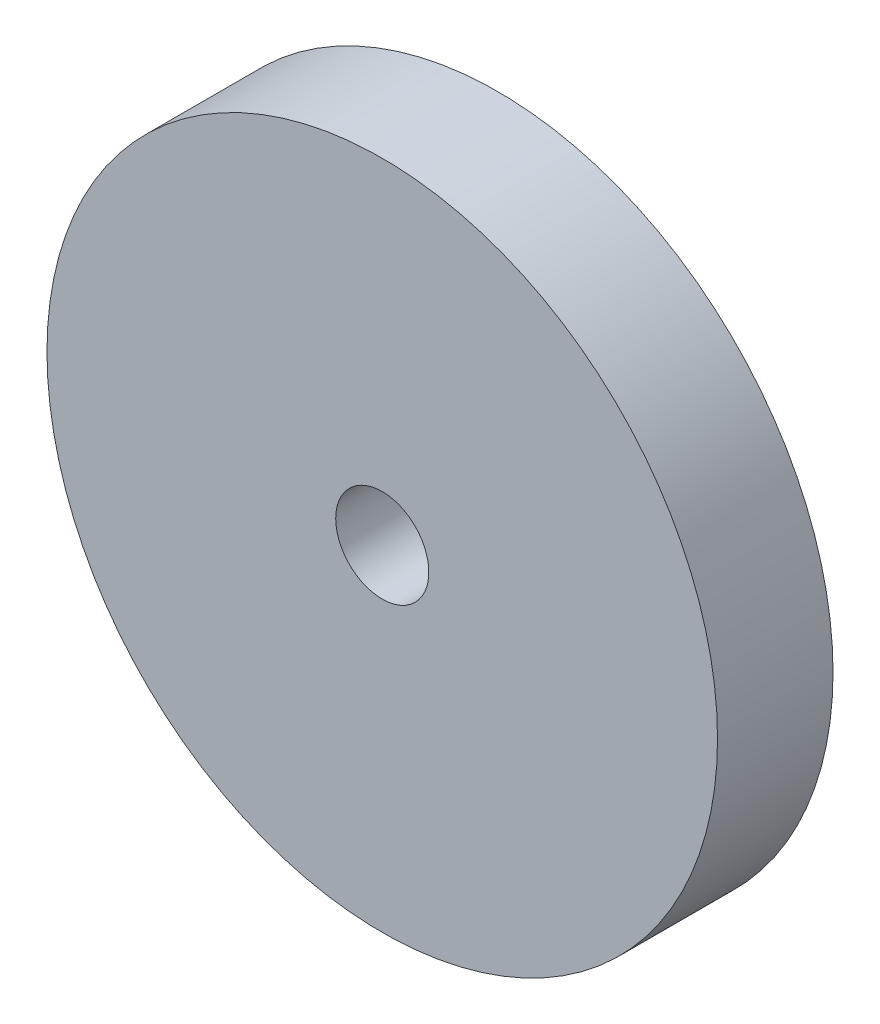
ISO-10303-21;
HEADER;
FILE_DESCRIPTION(('STEP AP214'),'2;1');
FILE_NAME('part.step','',(''),(''),'','','');
FILE_SCHEMA(('AUTOMOTIVE_DESIGN { 1 0 10303 214 1 1 1 1 }'));
ENDSEC;
DATA;
#1=APPLICATION_CONTEXT('core data for automotive mechanical design processes');
#2=APPLICATION_PROTOCOL_DEFINITION('international standard','automotive_design',2000,#1);
#3=PRODUCT_CONTEXT('',#1,'mechanical');
#4=PRODUCT('Part','Part','',(#3));
#5=PRODUCT_RELATED_PRODUCT_CATEGORY('part','',(#4));
#6=PRODUCT_DEFINITION_FORMATION('','',#4);
#7=PRODUCT_DEFINITION_CONTEXT('part definition',#1,'design');
#8=PRODUCT_DEFINITION('design','',#6,#7);
#9=PRODUCT_DEFINITION_SHAPE('','',#8);
#10=(LENGTH_UNIT() NAMED_UNIT(*) SI_UNIT(.MILLI.,.METRE.));
#11=(NAMED_UNIT(*) PLANE_ANGLE_UNIT() SI_UNIT($,.RADIAN.));
#12=(NAMED_UNIT(*) SI_UNIT($,.STERADIAN.) SOLID_ANGLE_UNIT());
#13=UNCERTAINTY_MEASURE_WITH_UNIT(LENGTH_MEASURE(1.E-05),#10,'distance_accuracy_value','');
#14=(GEOMETRIC_REPRESENTATION_CONTEXT(3) GLOBAL_UNCERTAINTY_ASSIGNED_CONTEXT((#13)) GLOBAL_UNIT_ASSIGNED_CONTEXT((#10,
#11,#12)) REPRESENTATION_CONTEXT('',''));
#15=CARTESIAN_POINT('',(0.,0.,0.));
#16=DIRECTION('',(0.,0.,1.));
#17=DIRECTION('',(1.,0.,0.));
#18=AXIS2_PLACEMENT_3D('',#15,#16,#17);
#19=CARTESIAN_POINT('',(0.,0.,6.2));
#20=DIRECTION('',(0.,0.,1.));
#21=DIRECTION('',(1.,0.,0.));
#22=AXIS2_PLACEMENT_3D('',#19,#20,#21);
#23=PLANE('',#22);
#24=CARTESIAN_POINT('',(0.,0.,6.2));
#25=DIRECTION('',(0.,0.,1.));
#26=DIRECTION('',(1.,0.,0.));
#27=AXIS2_PLACEMENT_3D('',#24,#25,#26);
#28=CIRCLE('',#27,18.);
#29=CARTESIAN_POINT('',(-18.,0.,6.2));
#30=VERTEX_POINT('',#29);
#31=EDGE_CURVE('E10',#30,#30,#28,.T.);
#32=ORIENTED_EDGE('',*,*,#31,.T.);
#33=EDGE_LOOP('',(#32));
#34=FACE_BOUND('',#33,.T.);
#35=CARTESIAN_POINT('',(0.,0.,6.2));
#36=DIRECTION('',(0.,0.,1.));
#37=DIRECTION('',(1.,0.,0.));
#38=AXIS2_PLACEMENT_3D('',#35,#36,#37);
#39=CIRCLE('',#38,2.5);
#40=CARTESIAN_POINT('',(-2.5,0.,6.2));
#41=VERTEX_POINT('',#40);
#42=EDGE_CURVE('E44',#41,#41,#39,.T.);
#43=ORIENTED_EDGE('',*,*,#42,.F.);
#44=EDGE_LOOP('',(#43));
#45=FACE_BOUND('',#44,.T.);
#46=ADVANCED_FACE('F33',(#34,#45),#23,.T.);
#47=CARTESIAN_POINT('',(0.,0.,0.));
#48=DIRECTION('',(0.,0.,1.));
#49=DIRECTION('',(1.,0.,0.));
#50=AXIS2_PLACEMENT_3D('',#47,#48,#49);
#51=PLANE('',#50);
#52=CARTESIAN_POINT('',(0.,0.,0.));
#53=DIRECTION('',(0.,0.,1.));
#54=DIRECTION('',(1.,0.,0.));
#55=AXIS2_PLACEMENT_3D('',#52,#53,#54);
#56=CIRCLE('',#55,18.);
#57=CARTESIAN_POINT('',(-18.,0.,0.));
#58=VERTEX_POINT('',#57);
#59=EDGE_CURVE('E37',#58,#58,#56,.T.);
#60=ORIENTED_EDGE('',*,*,#59,.F.);
#61=EDGE_LOOP('',(#60));
#62=FACE_BOUND('',#61,.T.);
#63=CARTESIAN_POINT('',(0.,0.,0.));
#64=DIRECTION('',(0.,0.,1.));
#65=DIRECTION('',(1.,0.,0.));
#66=AXIS2_PLACEMENT_3D('',#63,#64,#65);
#67=CIRCLE('',#66,2.5);
#68=CARTESIAN_POINT('',(-2.5,0.,0.));
#69=VERTEX_POINT('',#68);
#70=EDGE_CURVE('E46',#69,#69,#67,.T.);
#71=ORIENTED_EDGE('',*,*,#70,.T.);
#72=EDGE_LOOP('',(#71));
#73=FACE_BOUND('',#72,.T.);
#74=ADVANCED_FACE('F56',(#62,#73),#51,.F.);
#75=CARTESIAN_POINT('',(0.,0.,6.2));
#76=DIRECTION('',(0.,0.,-1.));
#77=DIRECTION('',(-1.,0.,0.));
#78=AXIS2_PLACEMENT_3D('',#75,#76,#77);
#79=CYLINDRICAL_SURFACE('',#78,18.);
#80=CARTESIAN_POINT('',(-18.,0.,6.2));
#81=CARTESIAN_POINT('',(-18.,0.,6.13541666666667));
#82=CARTESIAN_POINT('',(-18.,0.,6.07083333333333));
#83=CARTESIAN_POINT('',(-18.,0.,5.94166666666667));
#84=CARTESIAN_POINT('',(-18.,0.,5.87708333333333));
#85=CARTESIAN_POINT('',(-18.,0.,5.74791666666667));
#86=CARTESIAN_POINT('',(-18.,0.,5.68333333333333));
#87=CARTESIAN_POINT('',(-18.,0.,5.55416666666667));
#88=CARTESIAN_POINT('',(-18.,0.,5.48958333333333));
#89=CARTESIAN_POINT('',(-18.,0.,5.36041666666667));
#90=CARTESIAN_POINT('',(-18.,0.,5.29583333333333));
#91=CARTESIAN_POINT('',(-18.,0.,5.16666666666667));
#92=CARTESIAN_POINT('',(-18.,0.,5.10208333333333));
#93=CARTESIAN_POINT('',(-18.,0.,4.97291666666667));
#94=CARTESIAN_POINT('',(-18.,0.,4.90833333333333));
#95=CARTESIAN_POINT('',(-18.,0.,4.77916666666667));
#96=CARTESIAN_POINT('',(-18.,0.,4.71458333333333));
#97=CARTESIAN_POINT('',(-18.,0.,4.58541666666667));
#98=CARTESIAN_POINT('',(-18.,0.,4.52083333333333));
#99=CARTESIAN_POINT('',(-18.,0.,4.39166666666667));
#100=CARTESIAN_POINT('',(-18.,0.,4.32708333333333));
#101=CARTESIAN_POINT('',(-18.,0.,4.19791666666667));
#102=CARTESIAN_POINT('',(-18.,0.,4.13333333333333));
#103=CARTESIAN_POINT('',(-18.,0.,4.00416666666667));
#104=CARTESIAN_POINT('',(-18.,0.,3.93958333333333));
#105=CARTESIAN_POINT('',(-18.,0.,3.81041666666667));
#106=CARTESIAN_POINT('',(-18.,0.,3.74583333333333));
#107=CARTESIAN_POINT('',(-18.,0.,3.61666666666667));
#108=CARTESIAN_POINT('',(-18.,0.,3.55208333333333));
#109=CARTESIAN_POINT('',(-18.,0.,3.42291666666667));
#110=CARTESIAN_POINT('',(-18.,0.,3.35833333333333));
#111=CARTESIAN_POINT('',(-18.,0.,3.22916666666667));
#112=CARTESIAN_POINT('',(-18.,0.,3.16458333333333));
#113=CARTESIAN_POINT('',(-18.,0.,3.03541666666667));
#114=CARTESIAN_POINT('',(-18.,0.,2.97083333333333));
#115=CARTESIAN_POINT('',(-18.,0.,2.84166666666667));
#116=CARTESIAN_POINT('',(-18.,0.,2.77708333333333));
#117=CARTESIAN_POINT('',(-18.,0.,2.64791666666667));
#118=CARTESIAN_POINT('',(-18.,0.,2.58333333333333));
#119=CARTESIAN_POINT('',(-18.,0.,2.45416666666667));
#120=CARTESIAN_POINT('',(-18.,0.,2.38958333333333));
#121=CARTESIAN_POINT('',(-18.,0.,2.26041666666667));
#122=CARTESIAN_POINT('',(-18.,0.,2.19583333333333));
#123=CARTESIAN_POINT('',(-18.,0.,2.06666666666667));
#124=CARTESIAN_POINT('',(-18.,0.,2.00208333333333));
#125=CARTESIAN_POINT('',(-18.,0.,1.87291666666667));
#126=CARTESIAN_POINT('',(-18.,0.,1.80833333333333));
#127=CARTESIAN_POINT('',(-18.,0.,1.67916666666667));
#128=CARTESIAN_POINT('',(-18.,0.,1.61458333333333));
#129=CARTESIAN_POINT('',(-18.,0.,1.48541666666667));
#130=CARTESIAN_POINT('',(-18.,0.,1.42083333333333));
#131=CARTESIAN_POINT('',(-18.,0.,1.29166666666667));
#132=CARTESIAN_POINT('',(-18.,0.,1.22708333333333));
#133=CARTESIAN_POINT('',(-18.,0.,1.09791666666667));
#134=CARTESIAN_POINT('',(-18.,0.,1.03333333333333));
#135=CARTESIAN_POINT('',(-18.,0.,0.904166666666667));
#136=CARTESIAN_POINT('',(-18.,0.,0.839583333333333));
#137=CARTESIAN_POINT('',(-18.,0.,0.710416666666666));
#138=CARTESIAN_POINT('',(-18.,0.,0.645833333333333));
#139=CARTESIAN_POINT('',(-18.,0.,0.516666666666667));
#140=CARTESIAN_POINT('',(-18.,0.,0.452083333333333));
#141=CARTESIAN_POINT('',(-18.,0.,0.322916666666667));
#142=CARTESIAN_POINT('',(-18.,0.,0.258333333333334));
#143=CARTESIAN_POINT('',(-18.,0.,0.129166666666667));
#144=CARTESIAN_POINT('',(-18.,0.,0.0645833333333335));
#145=CARTESIAN_POINT('',(-18.,0.,0.));
#146=B_SPLINE_CURVE_WITH_KNOTS('',3,(#80,#81,#82,#83,#84,#85,#86,#87,#88,#89,#90,#91,#92,#93,
#94,#95,#96,#97,#98,#99,#100,#101,#102,#103,#104,#105,#106,#107,#108,#109,#110,#111,#112,#113,
#114,#115,#116,#117,#118,#119,#120,#121,#122,#123,#124,#125,#126,#127,#128,#129,#130,#131,#132,
#133,#134,#135,#136,#137,#138,#139,#140,#141,#142,#143,#144,#145),.UNSPECIFIED.,.F.,.F.,(4,2,2,
2,2,2,2,2,2,2,2,2,2,2,2,2,2,2,2,2,2,2,2,2,2,2,2,2,2,2,2,2,4),(0.,0.193749999999999,0.3875,
0.581249999999999,0.775,0.968749999999999,1.1625,1.35625,1.55,1.74375,1.9375,2.13125,2.325,
2.51875,2.7125,2.90625,3.1,3.29375,3.4875,3.68125,3.875,4.06875,4.2625,4.45625,4.65,4.84375,
5.0375,5.23125,5.425,5.61875,5.8125,6.00625,6.2),.UNSPECIFIED.);
#147=EDGE_CURVE('BSEAM35',#30,#58,#146,.T.);
#148=ORIENTED_EDGE('',*,*,#31,.F.);
#149=ORIENTED_EDGE('',*,*,#59,.T.);
#150=ORIENTED_EDGE('',*,*,#147,.T.);
#151=ORIENTED_EDGE('',*,*,#147,.F.);
#152=EDGE_LOOP('',(#148,#150,#149,#151));
#153=FACE_BOUND('',#152,.T.);
#154=ADVANCED_FACE('F35',(#153),#79,.T.);
#155=CARTESIAN_POINT('',(0.,0.,6.2));
#156=DIRECTION('',(0.,0.,-1.));
#157=DIRECTION('',(-1.,0.,0.));
#158=AXIS2_PLACEMENT_3D('',#155,#156,#157);
#159=CYLINDRICAL_SURFACE('',#158,2.5);
#160=CARTESIAN_POINT('',(-2.5,0.,6.2));
#161=CARTESIAN_POINT('',(-2.5,0.,6.13541666666667));
#162=CARTESIAN_POINT('',(-2.5,0.,6.07083333333333));
#163=CARTESIAN_POINT('',(-2.5,0.,5.94166666666667));
#164=CARTESIAN_POINT('',(-2.5,0.,5.87708333333333));
#165=CARTESIAN_POINT('',(-2.5,0.,5.74791666666667));
#166=CARTESIAN_POINT('',(-2.5,0.,5.68333333333333));
#167=CARTESIAN_POINT('',(-2.5,0.,5.55416666666667));
#168=CARTESIAN_POINT('',(-2.5,0.,5.48958333333333));
#169=CARTESIAN_POINT('',(-2.5,0.,5.36041666666667));
#170=CARTESIAN_POINT('',(-2.5,0.,5.29583333333333));
#171=CARTESIAN_POINT('',(-2.5,0.,5.16666666666667));
#172=CARTESIAN_POINT('',(-2.5,0.,5.10208333333333));
#173=CARTESIAN_POINT('',(-2.5,0.,4.97291666666667));
#174=CARTESIAN_POINT('',(-2.5,0.,4.90833333333333));
#175=CARTESIAN_POINT('',(-2.5,0.,4.77916666666667));
#176=CARTESIAN_POINT('',(-2.5,0.,4.71458333333333));
#177=CARTESIAN_POINT('',(-2.5,0.,4.58541666666667));
#178=CARTESIAN_POINT('',(-2.5,0.,4.52083333333333));
#179=CARTESIAN_POINT('',(-2.5,0.,4.39166666666667));
#180=CARTESIAN_POINT('',(-2.5,0.,4.32708333333333));
#181=CARTESIAN_POINT('',(-2.5,0.,4.19791666666667));
#182=CARTESIAN_POINT('',(-2.5,0.,4.13333333333333));
#183=CARTESIAN_POINT('',(-2.5,0.,4.00416666666667));
#184=CARTESIAN_POINT('',(-2.5,0.,3.93958333333333));
#185=CARTESIAN_POINT('',(-2.5,0.,3.81041666666667));
#186=CARTESIAN_POINT('',(-2.5,0.,3.74583333333333));
#187=CARTESIAN_POINT('',(-2.5,0.,3.61666666666667));
#188=CARTESIAN_POINT('',(-2.5,0.,3.55208333333333));
#189=CARTESIAN_POINT('',(-2.5,0.,3.42291666666667));
#190=CARTESIAN_POINT('',(-2.5,0.,3.35833333333333));
#191=CARTESIAN_POINT('',(-2.5,0.,3.22916666666667));
#192=CARTESIAN_POINT('',(-2.5,0.,3.16458333333333));
#193=CARTESIAN_POINT('',(-2.5,0.,3.03541666666667));
#194=CARTESIAN_POINT('',(-2.5,0.,2.97083333333333));
#195=CARTESIAN_POINT('',(-2.5,0.,2.84166666666667));
#196=CARTESIAN_POINT('',(-2.5,0.,2.77708333333333));
#197=CARTESIAN_POINT('',(-2.5,0.,2.64791666666667));
#198=CARTESIAN_POINT('',(-2.5,0.,2.58333333333333));
#199=CARTESIAN_POINT('',(-2.5,0.,2.45416666666667));
#200=CARTESIAN_POINT('',(-2.5,0.,2.38958333333333));
#201=CARTESIAN_POINT('',(-2.5,0.,2.26041666666667));
#202=CARTESIAN_POINT('',(-2.5,0.,2.19583333333333));
#203=CARTESIAN_POINT('',(-2.5,0.,2.06666666666667));
#204=CARTESIAN_POINT('',(-2.5,0.,2.00208333333333));
#205=CARTESIAN_POINT('',(-2.5,0.,1.87291666666667));
#206=CARTESIAN_POINT('',(-2.5,0.,1.80833333333333));
#207=CARTESIAN_POINT('',(-2.5,0.,1.67916666666667));
#208=CARTESIAN_POINT('',(-2.5,0.,1.61458333333333));
#209=CARTESIAN_POINT('',(-2.5,0.,1.48541666666667));
#210=CARTESIAN_POINT('',(-2.5,0.,1.42083333333333));
#211=CARTESIAN_POINT('',(-2.5,0.,1.29166666666667));
#212=CARTESIAN_POINT('',(-2.5,0.,1.22708333333333));
#213=CARTESIAN_POINT('',(-2.5,0.,1.09791666666667));
#214=CARTESIAN_POINT('',(-2.5,0.,1.03333333333333));
#215=CARTESIAN_POINT('',(-2.5,0.,0.904166666666667));
#216=CARTESIAN_POINT('',(-2.5,0.,0.839583333333333));
#217=CARTESIAN_POINT('',(-2.5,0.,0.710416666666666));
#218=CARTESIAN_POINT('',(-2.5,0.,0.645833333333333));
#219=CARTESIAN_POINT('',(-2.5,0.,0.516666666666667));
#220=CARTESIAN_POINT('',(-2.5,0.,0.452083333333333));
#221=CARTESIAN_POINT('',(-2.5,0.,0.322916666666667));
#222=CARTESIAN_POINT('',(-2.5,0.,0.258333333333334));
#223=CARTESIAN_POINT('',(-2.5,0.,0.129166666666667));
#224=CARTESIAN_POINT('',(-2.5,0.,0.0645833333333335));
#225=CARTESIAN_POINT('',(-2.5,0.,0.));
#226=B_SPLINE_CURVE_WITH_KNOTS('',3,(#160,#161,#162,#163,#164,#165,#166,#167,#168,#169,#170,
#171,#172,#173,#174,#175,#176,#177,#178,#179,#180,#181,#182,#183,#184,#185,#186,#187,#188,#189,
#190,#191,#192,#193,#194,#195,#196,#197,#198,#199,#200,#201,#202,#203,#204,#205,#206,#207,#208,
#209,#210,#211,#212,#213,#214,#215,#216,#217,#218,#219,#220,#221,#222,#223,#224,#225),
.UNSPECIFIED.,.F.,.F.,(4,2,2,2,2,2,2,2,2,2,2,2,2,2,2,2,2,2,2,2,2,2,2,2,2,2,2,2,2,2,2,2,4),(0.,
0.193749999999999,0.3875,0.581249999999999,0.775,0.968749999999999,1.1625,1.35625,1.55,1.74375,
1.9375,2.13125,2.325,2.51875,2.7125,2.90625,3.1,3.29375,3.4875,3.68125,3.875,4.06875,4.2625,
4.45625,4.65,4.84375,5.0375,5.23125,5.425,5.61875,5.8125,6.00625,6.2),.UNSPECIFIED.);
#227=EDGE_CURVE('BSEAM52',#41,#69,#226,.T.);
#228=ORIENTED_EDGE('',*,*,#42,.T.);
#229=ORIENTED_EDGE('',*,*,#70,.F.);
#230=ORIENTED_EDGE('',*,*,#227,.T.);
#231=ORIENTED_EDGE('',*,*,#227,.F.);
#232=EDGE_LOOP('',(#228,#230,#229,#231));
#233=FACE_BOUND('',#232,.T.);
#234=ADVANCED_FACE('F52',(#233),#159,.F.);
#235=CLOSED_SHELL('',(#46,#74,#154,#234));
#236=MANIFOLD_SOLID_BREP('B2',#235);
#237=ADVANCED_BREP_SHAPE_REPRESENTATION('',(#18,#236),#14);
#238=SHAPE_DEFINITION_REPRESENTATION(#9,#237);
ENDSEC;
END-ISO-10303-21;
